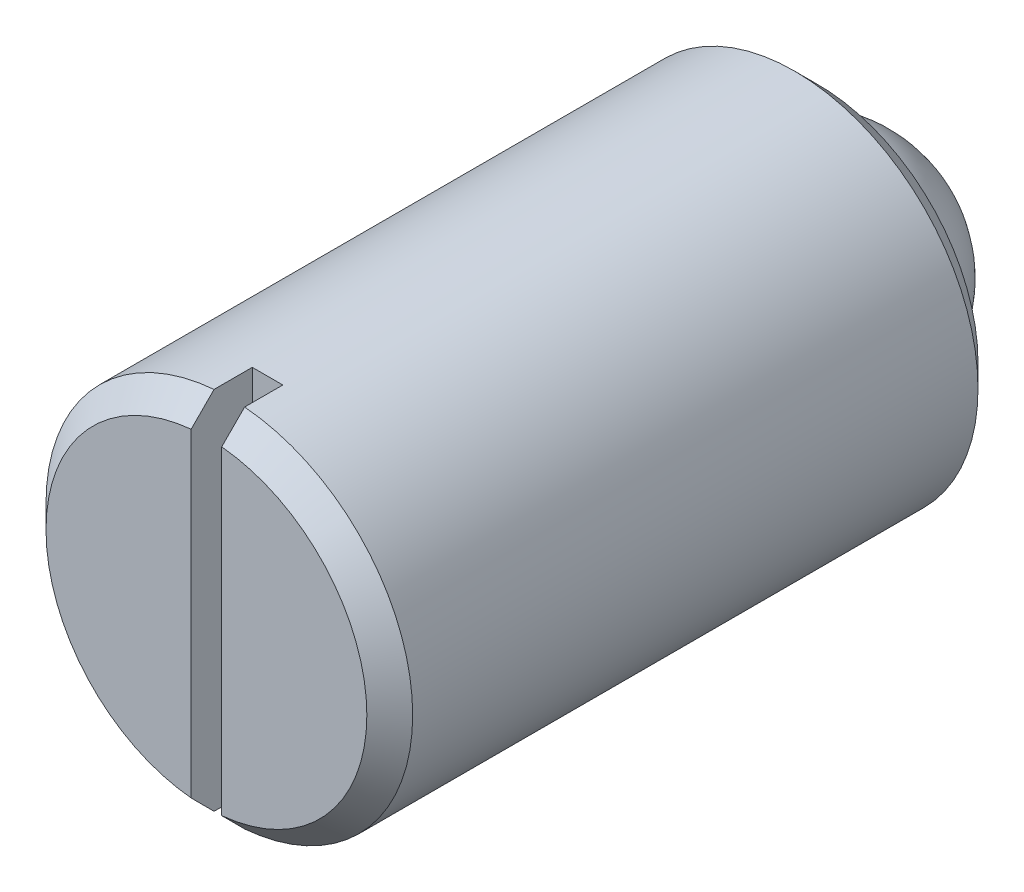
ISO-10303-21;
HEADER;
FILE_DESCRIPTION(('STEP AP214'),'2;1');
FILE_NAME('part.step','',(''),(''),'','','');
FILE_SCHEMA(('AUTOMOTIVE_DESIGN { 1 0 10303 214 1 1 1 1 }'));
ENDSEC;
DATA;
#1=APPLICATION_CONTEXT('core data for automotive mechanical design processes');
#2=APPLICATION_PROTOCOL_DEFINITION('international standard','automotive_design',2000,#1);
#3=PRODUCT_CONTEXT('',#1,'mechanical');
#4=PRODUCT('Part','Part','',(#3));
#5=PRODUCT_RELATED_PRODUCT_CATEGORY('part','',(#4));
#6=PRODUCT_DEFINITION_FORMATION('','',#4);
#7=PRODUCT_DEFINITION_CONTEXT('part definition',#1,'design');
#8=PRODUCT_DEFINITION('design','',#6,#7);
#9=PRODUCT_DEFINITION_SHAPE('','',#8);
#10=(LENGTH_UNIT() NAMED_UNIT(*) SI_UNIT(.MILLI.,.METRE.));
#11=(NAMED_UNIT(*) PLANE_ANGLE_UNIT() SI_UNIT($,.RADIAN.));
#12=(NAMED_UNIT(*) SI_UNIT($,.STERADIAN.) SOLID_ANGLE_UNIT());
#13=UNCERTAINTY_MEASURE_WITH_UNIT(LENGTH_MEASURE(1.E-05),#10,'distance_accuracy_value','');
#14=(GEOMETRIC_REPRESENTATION_CONTEXT(3) GLOBAL_UNCERTAINTY_ASSIGNED_CONTEXT((#13)) GLOBAL_UNIT_ASSIGNED_CONTEXT((#10,
#11,#12)) REPRESENTATION_CONTEXT('',''));
#15=CARTESIAN_POINT('',(0.,0.,0.));
#16=DIRECTION('',(0.,0.,1.));
#17=DIRECTION('',(1.,0.,0.));
#18=AXIS2_PLACEMENT_3D('',#15,#16,#17);
#19=CARTESIAN_POINT('',(0.,0.,0.));
#20=DIRECTION('',(0.,0.,1.));
#21=DIRECTION('',(1.,0.,0.));
#22=AXIS2_PLACEMENT_3D('',#19,#20,#21);
#23=PLANE('',#22);
#24=CARTESIAN_POINT('',(0.,0.,0.));
#25=DIRECTION('',(0.,0.,1.));
#26=DIRECTION('',(1.,0.,0.));
#27=AXIS2_PLACEMENT_3D('',#24,#25,#26);
#28=CIRCLE('',#27,5.25);
#29=CARTESIAN_POINT('',(5.25,0.,0.));
#30=VERTEX_POINT('',#29);
#31=EDGE_CURVE('E111',#30,#30,#28,.F.);
#32=ORIENTED_EDGE('',*,*,#31,.T.);
#33=EDGE_LOOP('',(#32));
#34=FACE_BOUND('',#33,.T.);
#35=CARTESIAN_POINT('',(0.,0.,0.));
#36=DIRECTION('',(0.,0.,1.));
#37=DIRECTION('',(1.,0.,0.));
#38=AXIS2_PLACEMENT_3D('',#35,#36,#37);
#39=CIRCLE('',#38,3.96862696659689);
#40=CARTESIAN_POINT('',(3.96862696659689,0.,0.));
#41=VERTEX_POINT('',#40);
#42=EDGE_CURVE('E11',#41,#41,#39,.F.);
#43=ORIENTED_EDGE('',*,*,#42,.F.);
#44=EDGE_LOOP('',(#43));
#45=FACE_BOUND('',#44,.T.);
#46=ADVANCED_FACE('F33',(#34,#45),#23,.F.);
#47=CARTESIAN_POINT('',(0.,0.,20.));
#48=DIRECTION('',(0.,0.,1.));
#49=DIRECTION('',(1.,0.,0.));
#50=AXIS2_PLACEMENT_3D('',#47,#48,#49);
#51=PLANE('',#50);
#52=DIRECTION('',(0.,-1.,0.));
#53=VECTOR('',#52,1.);
#54=CARTESIAN_POINT('',(-0.5,-5.9791303715507,20.));
#55=LINE('',#54,#53);
#56=CARTESIAN_POINT('',(-0.5,5.22613624009171,20.));
#57=VERTEX_POINT('',#56);
#58=CARTESIAN_POINT('',(-0.5,-5.22613624009171,20.));
#59=VERTEX_POINT('',#58);
#60=EDGE_CURVE('E85',#57,#59,#55,.T.);
#61=ORIENTED_EDGE('',*,*,#60,.F.);
#62=CARTESIAN_POINT('',(0.,0.,20.));
#63=DIRECTION('',(0.,0.,1.));
#64=DIRECTION('',(1.,0.,0.));
#65=AXIS2_PLACEMENT_3D('',#62,#63,#64);
#66=CIRCLE('',#65,5.25);
#67=EDGE_CURVE('E97',#57,#59,#66,.T.);
#68=ORIENTED_EDGE('',*,*,#67,.T.);
#69=EDGE_LOOP('',(#61,#68));
#70=FACE_BOUND('',#69,.T.);
#71=ADVANCED_FACE('F96',(#70),#51,.T.);
#72=CARTESIAN_POINT('',(0.,0.,20.));
#73=DIRECTION('',(0.,0.,-1.));
#74=DIRECTION('',(-1.,0.,0.));
#75=AXIS2_PLACEMENT_3D('',#72,#73,#74);
#76=CONICAL_SURFACE('',#75,5.25,0.785398163397442);
#77=CARTESIAN_POINT('',(-0.5,9.92785552367159,15.3095616143503));
#78=CARTESIAN_POINT('',(-0.5,9.55208986103591,15.684845998594));
#79=CARTESIAN_POINT('',(-0.5,9.17630246654769,16.0601086400427));
#80=CARTESIAN_POINT('',(-0.5,8.42465346395782,16.8105507691537));
#81=CARTESIAN_POINT('',(-0.5,8.04879185677857,17.1857302577398));
#82=CARTESIAN_POINT('',(-0.5,7.29696704537191,17.9359630642628));
#83=CARTESIAN_POINT('',(-0.5,6.92100384483147,18.3110163858942));
#84=CARTESIAN_POINT('',(-0.5,6.16889213458774,19.0609458038307));
#85=CARTESIAN_POINT('',(-0.5,5.79274362282101,19.4358218980669));
#86=CARTESIAN_POINT('',(-0.5,5.22826724423608,19.9979065070319));
#87=CARTESIAN_POINT('',(-0.5,5.04005989371646,20.1852360397427));
#88=CARTESIAN_POINT('',(-0.5,4.66353260389824,20.559780241167));
#89=CARTESIAN_POINT('',(-0.5,4.47521266510877,20.7469949103924));
#90=CARTESIAN_POINT('',(-0.5,4.09841687086862,21.1212541999924));
#91=CARTESIAN_POINT('',(-0.5,3.90994102107969,21.3082988260653));
#92=CARTESIAN_POINT('',(-0.5,3.53273897497511,21.6821415648597));
#93=CARTESIAN_POINT('',(-0.5,3.34401277468829,21.8689396735749));
#94=CARTESIAN_POINT('',(-0.5,2.96614271210536,22.2421588353597));
#95=CARTESIAN_POINT('',(-0.5,2.77699880247174,22.4285798405656));
#96=CARTESIAN_POINT('',(-0.5,2.49275132554391,22.707659712793));
#97=CARTESIAN_POINT('',(-0.5,2.39791616363466,22.8005918652702));
#98=CARTESIAN_POINT('',(-0.5,2.20798895317973,22.9861967088872));
#99=CARTESIAN_POINT('',(-0.5,2.11289690036256,23.0788693956599));
#100=CARTESIAN_POINT('',(-0.5,1.92232227766392,23.2638485818307));
#101=CARTESIAN_POINT('',(-0.5,1.82683963753384,23.3561550088927));
#102=CARTESIAN_POINT('',(-0.5,1.63530782922047,23.5401711609692));
#103=CARTESIAN_POINT('',(-0.5,1.53925868757899,23.6318809135224));
#104=CARTESIAN_POINT('',(-0.5,1.39445591778969,23.7686960304433));
#105=CARTESIAN_POINT('',(-0.5,1.34606145186328,23.814181115599));
#106=CARTESIAN_POINT('',(-0.5,1.24894665245089,23.9047998156198));
#107=CARTESIAN_POINT('',(-0.5,1.20022632714219,23.9499334392437));
#108=CARTESIAN_POINT('',(-0.5,1.10233613956681,24.0397291511785));
#109=CARTESIAN_POINT('',(-0.5,1.05316620438443,24.0843911603806));
#110=CARTESIAN_POINT('',(-0.5,0.954163828114459,24.1729822862607));
#111=CARTESIAN_POINT('',(-0.5,0.904331329393397,24.2169113384226));
#112=CARTESIAN_POINT('',(-0.5,0.854061372818657,24.2603430753333));
#113=B_SPLINE_CURVE_WITH_KNOTS('',3,(#77,#78,#79,#80,#81,#82,#83,#84,#85,#86,#87,#88,#89,#90,
#91,#92,#93,#94,#95,#96,#97,#98,#99,#100,#101,#102,#103,#104,#105,#106,#107,#108,#109,#110,#111,
#112),.UNSPECIFIED.,.F.,.F.,(4,2,2,2,2,2,2,2,2,2,2,2,2,2,2,2,2,4),(0.,1.59321808890009,
3.18641748626993,4.77956525558484,6.37273118470356,7.16936735624743,7.96599995213189,
8.76260478854389,9.55922241590227,10.355935499873,10.75427026916,11.1526117031128,
11.5510282412514,11.9494262586934,12.1486691296625,12.3479070193428,12.5471778147686,
12.7464660587827),.UNSPECIFIED.);
#114=CARTESIAN_POINT('',(-0.5,5.9791303715507,19.25));
#115=VERTEX_POINT('',#114);
#116=EDGE_CURVE('E82',#115,#57,#113,.T.);
#117=ORIENTED_EDGE('',*,*,#116,.F.);
#118=CARTESIAN_POINT('',(0.,0.,19.25));
#119=DIRECTION('',(0.,0.,1.));
#120=DIRECTION('',(1.,0.,0.));
#121=AXIS2_PLACEMENT_3D('',#118,#119,#120);
#122=CIRCLE('',#121,6.);
#123=CARTESIAN_POINT('',(-0.5,-5.9791303715507,19.25));
#124=VERTEX_POINT('',#123);
#125=EDGE_CURVE('E120',#124,#115,#122,.F.);
#126=ORIENTED_EDGE('',*,*,#125,.F.);
#127=CARTESIAN_POINT('',(-0.5,-0.854061372818657,24.2603430753333));
#128=CARTESIAN_POINT('',(-0.5,-0.890663688130079,24.2287410615308));
#129=CARTESIAN_POINT('',(-0.5,-0.927023175140503,24.1968613113027));
#130=CARTESIAN_POINT('',(-0.5,-0.999355657248269,24.1326697518856));
#131=CARTESIAN_POINT('',(-0.5,-1.03532867306181,24.1003579660658));
#132=CARTESIAN_POINT('',(-0.5,-1.14281242968219,24.0029637212403));
#133=CARTESIAN_POINT('',(-0.5,-1.21389822374194,23.937413325114));
#134=CARTESIAN_POINT('',(-0.5,-1.35535946982899,23.8055801291376));
#135=CARTESIAN_POINT('',(-0.5,-1.42573505068665,23.7392974668597));
#136=CARTESIAN_POINT('',(-0.5,-1.56602555539737,23.6062403724618));
#137=CARTESIAN_POINT('',(-0.5,-1.63594045739789,23.5394659173271));
#138=CARTESIAN_POINT('',(-0.5,-1.84513158259419,23.3387312538789));
#139=CARTESIAN_POINT('',(-0.5,-1.98393738517831,23.2042814333445));
#140=CARTESIAN_POINT('',(-0.5,-2.2608834189938,22.9346976243412));
#141=CARTESIAN_POINT('',(-0.5,-2.39902364393293,22.799563629429));
#142=CARTESIAN_POINT('',(-0.5,-2.81285574928011,22.3935636082175));
#143=CARTESIAN_POINT('',(-0.5,-3.08795984462832,22.1220987847406));
#144=CARTESIAN_POINT('',(-0.5,-3.63755330185618,21.5784507138305));
#145=CARTESIAN_POINT('',(-0.5,-3.91204254425767,21.3062673459524));
#146=CARTESIAN_POINT('',(-0.5,-4.460651978155,20.7615316622949));
#147=CARTESIAN_POINT('',(-0.5,-4.73477217159451,20.4889793484739));
#148=CARTESIAN_POINT('',(-0.5,-5.07674086011498,20.14870069462));
#149=CARTESIAN_POINT('',(-0.5,-5.14468943255713,20.0810748191367));
#150=CARTESIAN_POINT('',(-0.5,-5.28057188169016,19.9458132522244));
#151=CARTESIAN_POINT('',(-0.5,-5.34850575882625,19.8781775612426));
#152=CARTESIAN_POINT('',(-0.5,-5.79270269418511,19.4358620966435));
#153=CARTESIAN_POINT('',(-0.5,-6.16881079662503,19.0610267145125));
#154=CARTESIAN_POINT('',(-0.5,-6.92084581271849,18.3111741496641));
#155=CARTESIAN_POINT('',(-0.5,-7.29677272633867,17.9361569669132));
#156=CARTESIAN_POINT('',(-0.5,-8.04860198707189,17.1859197307551));
#157=CARTESIAN_POINT('',(-0.5,-8.42450430722193,16.8106996503289));
#158=CARTESIAN_POINT('',(-0.5,-9.17623018174267,16.0601808438369));
#159=CARTESIAN_POINT('',(-0.5,-9.55205373613945,15.6848821177973));
#160=CARTESIAN_POINT('',(-0.5,-9.92785552367159,15.3095616143503));
#161=B_SPLINE_CURVE_WITH_KNOTS('',3,(#127,#128,#129,#130,#131,#132,#133,#134,#135,#136,#137,
#138,#139,#140,#141,#142,#143,#144,#145,#146,#147,#148,#149,#150,#151,#152,#153,#154,#155,#156,
#157,#158,#159,#160),.UNSPECIFIED.,.F.,.F.,(4,2,2,2,2,2,2,2,2,2,2,2,2,2,2,2,4),(0.,
0.145066793652974,0.290125772027515,0.580202504059539,0.870225635506728,1.16026242672066,
1.73999333365692,2.31972971054564,3.47919918631749,4.63887722490446,5.79854913168538,
6.0861467854372,6.3737339611719,7.96672780035323,9.55972193274675,11.153093803501,
12.7464651458822),.UNSPECIFIED.);
#162=EDGE_CURVE('E101',#59,#124,#161,.T.);
#163=ORIENTED_EDGE('',*,*,#162,.F.);
#164=ORIENTED_EDGE('',*,*,#67,.F.);
#165=EDGE_LOOP('',(#117,#126,#163,#164));
#166=FACE_BOUND('',#165,.T.);
#167=ADVANCED_FACE('F100',(#166),#76,.T.);
#168=CARTESIAN_POINT('',(0.5,0.854061372818657,24.2603430753333));
#169=CARTESIAN_POINT('',(0.5,0.890663688130079,24.2287410615308));
#170=CARTESIAN_POINT('',(0.5,0.927023175140503,24.1968613113027));
#171=CARTESIAN_POINT('',(0.5,0.999355657248269,24.1326697518856));
#172=CARTESIAN_POINT('',(0.5,1.03532867306181,24.1003579660658));
#173=CARTESIAN_POINT('',(0.5,1.14281242968219,24.0029637212403));
#174=CARTESIAN_POINT('',(0.5,1.21389822374194,23.937413325114));
#175=CARTESIAN_POINT('',(0.5,1.35535946982899,23.8055801291376));
#176=CARTESIAN_POINT('',(0.5,1.42573505068665,23.7392974668597));
#177=CARTESIAN_POINT('',(0.5,1.56602555539737,23.6062403724618));
#178=CARTESIAN_POINT('',(0.5,1.63594045739789,23.5394659173271));
#179=CARTESIAN_POINT('',(0.5,1.84513158259419,23.3387312538789));
#180=CARTESIAN_POINT('',(0.5,1.98393738517831,23.2042814333445));
#181=CARTESIAN_POINT('',(0.5,2.2608834189938,22.9346976243412));
#182=CARTESIAN_POINT('',(0.5,2.39902364393293,22.799563629429));
#183=CARTESIAN_POINT('',(0.5,2.81285574928011,22.3935636082175));
#184=CARTESIAN_POINT('',(0.5,3.08795984462832,22.1220987847406));
#185=CARTESIAN_POINT('',(0.5,3.63755330185618,21.5784507138305));
#186=CARTESIAN_POINT('',(0.5,3.91204254425767,21.3062673459524));
#187=CARTESIAN_POINT('',(0.5,4.460651978155,20.7615316622949));
#188=CARTESIAN_POINT('',(0.5,4.73477217159451,20.4889793484739));
#189=CARTESIAN_POINT('',(0.5,5.07674086011498,20.14870069462));
#190=CARTESIAN_POINT('',(0.5,5.14468943255713,20.0810748191367));
#191=CARTESIAN_POINT('',(0.5,5.28057188169016,19.9458132522244));
#192=CARTESIAN_POINT('',(0.5,5.34850575882625,19.8781775612426));
#193=CARTESIAN_POINT('',(0.5,5.79270269418511,19.4358620966435));
#194=CARTESIAN_POINT('',(0.5,6.16881079662503,19.0610267145125));
#195=CARTESIAN_POINT('',(0.5,6.92084581271849,18.3111741496641));
#196=CARTESIAN_POINT('',(0.5,7.29677272633867,17.9361569669132));
#197=CARTESIAN_POINT('',(0.5,8.04860198707189,17.1859197307551));
#198=CARTESIAN_POINT('',(0.5,8.42450430722193,16.8106996503289));
#199=CARTESIAN_POINT('',(0.5,9.17623018174267,16.0601808438369));
#200=CARTESIAN_POINT('',(0.5,9.55205373613945,15.6848821177973));
#201=CARTESIAN_POINT('',(0.5,9.92785552367159,15.3095616143503));
#202=B_SPLINE_CURVE_WITH_KNOTS('',3,(#168,#169,#170,#171,#172,#173,#174,#175,#176,#177,#178,
#179,#180,#181,#182,#183,#184,#185,#186,#187,#188,#189,#190,#191,#192,#193,#194,#195,#196,#197,
#198,#199,#200,#201),.UNSPECIFIED.,.F.,.F.,(4,2,2,2,2,2,2,2,2,2,2,2,2,2,2,2,4),(0.,
0.145066793652974,0.290125772027515,0.580202504059539,0.870225635506728,1.16026242672066,
1.73999333365692,2.31972971054564,3.47919918631749,4.63887722490446,5.79854913168538,
6.0861467854372,6.3737339611719,7.96672780035323,9.55972193274675,11.153093803501,
12.7464651458822),.UNSPECIFIED.);
#203=CARTESIAN_POINT('',(0.5,5.22613624009171,20.));
#204=VERTEX_POINT('',#203);
#205=CARTESIAN_POINT('',(0.5,5.9791303715507,19.25));
#206=VERTEX_POINT('',#205);
#207=EDGE_CURVE('E149',#204,#206,#202,.T.);
#208=ORIENTED_EDGE('',*,*,#207,.F.);
#209=CARTESIAN_POINT('',(0.5,-5.22613624009171,20.));
#210=VERTEX_POINT('',#209);
#211=EDGE_CURVE('E104',#210,#204,#66,.T.);
#212=ORIENTED_EDGE('',*,*,#211,.F.);
#213=CARTESIAN_POINT('',(0.5,-9.92785552367159,15.3095616143503));
#214=CARTESIAN_POINT('',(0.5,-9.55208986103591,15.684845998594));
#215=CARTESIAN_POINT('',(0.5,-9.17630246654769,16.0601086400427));
#216=CARTESIAN_POINT('',(0.5,-8.42465346395782,16.8105507691537));
#217=CARTESIAN_POINT('',(0.5,-8.04879185677857,17.1857302577398));
#218=CARTESIAN_POINT('',(0.5,-7.29696704537191,17.9359630642628));
#219=CARTESIAN_POINT('',(0.5,-6.92100384483147,18.3110163858942));
#220=CARTESIAN_POINT('',(0.5,-6.16889213458774,19.0609458038307));
#221=CARTESIAN_POINT('',(0.5,-5.79274362282101,19.4358218980669));
#222=CARTESIAN_POINT('',(0.5,-5.22826724423608,19.9979065070319));
#223=CARTESIAN_POINT('',(0.5,-5.04005989371646,20.1852360397427));
#224=CARTESIAN_POINT('',(0.5,-4.66353260389824,20.559780241167));
#225=CARTESIAN_POINT('',(0.5,-4.47521266510877,20.7469949103924));
#226=CARTESIAN_POINT('',(0.5,-4.09841687086862,21.1212541999924));
#227=CARTESIAN_POINT('',(0.5,-3.90994102107969,21.3082988260653));
#228=CARTESIAN_POINT('',(0.5,-3.53273897497511,21.6821415648597));
#229=CARTESIAN_POINT('',(0.5,-3.34401277468829,21.8689396735749));
#230=CARTESIAN_POINT('',(0.5,-2.96614271210536,22.2421588353597));
#231=CARTESIAN_POINT('',(0.5,-2.77699880247174,22.4285798405656));
#232=CARTESIAN_POINT('',(0.5,-2.49275132554391,22.707659712793));
#233=CARTESIAN_POINT('',(0.5,-2.39791616363466,22.8005918652702));
#234=CARTESIAN_POINT('',(0.5,-2.20798895317973,22.9861967088872));
#235=CARTESIAN_POINT('',(0.5,-2.11289690036256,23.0788693956599));
#236=CARTESIAN_POINT('',(0.5,-1.92232227766392,23.2638485818307));
#237=CARTESIAN_POINT('',(0.5,-1.82683963753384,23.3561550088927));
#238=CARTESIAN_POINT('',(0.5,-1.63530782922047,23.5401711609692));
#239=CARTESIAN_POINT('',(0.5,-1.53925868757899,23.6318809135224));
#240=CARTESIAN_POINT('',(0.5,-1.39445591778969,23.7686960304433));
#241=CARTESIAN_POINT('',(0.5,-1.34606145186328,23.814181115599));
#242=CARTESIAN_POINT('',(0.5,-1.24894665245089,23.9047998156198));
#243=CARTESIAN_POINT('',(0.5,-1.20022632714219,23.9499334392437));
#244=CARTESIAN_POINT('',(0.5,-1.10233613956681,24.0397291511785));
#245=CARTESIAN_POINT('',(0.5,-1.05316620438443,24.0843911603806));
#246=CARTESIAN_POINT('',(0.5,-0.954163828114459,24.1729822862607));
#247=CARTESIAN_POINT('',(0.5,-0.904331329393397,24.2169113384226));
#248=CARTESIAN_POINT('',(0.5,-0.854061372818657,24.2603430753333));
#249=B_SPLINE_CURVE_WITH_KNOTS('',3,(#213,#214,#215,#216,#217,#218,#219,#220,#221,#222,#223,
#224,#225,#226,#227,#228,#229,#230,#231,#232,#233,#234,#235,#236,#237,#238,#239,#240,#241,#242,
#243,#244,#245,#246,#247,#248),.UNSPECIFIED.,.F.,.F.,(4,2,2,2,2,2,2,2,2,2,2,2,2,2,2,2,2,4),(0.,
1.59321808890009,3.18641748626993,4.77956525558484,6.37273118470356,7.16936735624743,
7.96599995213189,8.76260478854389,9.55922241590227,10.355935499873,10.75427026916,
11.1526117031128,11.5510282412514,11.9494262586934,12.1486691296625,12.3479070193428,
12.5471778147686,12.7464660587827),.UNSPECIFIED.);
#250=CARTESIAN_POINT('',(0.5,-5.9791303715507,19.25));
#251=VERTEX_POINT('',#250);
#252=EDGE_CURVE('E117',#251,#210,#249,.T.);
#253=ORIENTED_EDGE('',*,*,#252,.F.);
#254=EDGE_CURVE('E106',#206,#251,#122,.F.);
#255=ORIENTED_EDGE('',*,*,#254,.F.);
#256=EDGE_LOOP('',(#208,#212,#253,#255));
#257=FACE_BOUND('',#256,.T.);
#258=ADVANCED_FACE('F136',(#257),#76,.T.);
#259=CARTESIAN_POINT('',(0.,0.,20.));
#260=DIRECTION('',(0.,0.,-1.));
#261=DIRECTION('',(-1.,0.,0.));
#262=AXIS2_PLACEMENT_3D('',#259,#260,#261);
#263=CYLINDRICAL_SURFACE('',#262,6.);
#264=CARTESIAN_POINT('',(0.5,5.9791303715507,18.));
#265=DIRECTION('',(-1.,0.,0.));
#266=VECTOR('',#265,1.);
#267=LINE('',#264,#266);
#268=CARTESIAN_POINT('',(0.5,5.9791303715507,18.));
#269=VERTEX_POINT('',#268);
#270=CARTESIAN_POINT('',(-0.5,5.9791303715507,18.));
#271=VERTEX_POINT('',#270);
#272=EDGE_CURVE('E43',#269,#271,#267,.T.);
#273=ORIENTED_EDGE('',*,*,#272,.F.);
#274=DIRECTION('',(0.,0.,-1.));
#275=VECTOR('',#274,1.);
#276=CARTESIAN_POINT('',(0.5,5.9791303715507,20.));
#277=LINE('',#276,#275);
#278=EDGE_CURVE('E102',#269,#206,#277,.F.);
#279=ORIENTED_EDGE('',*,*,#278,.T.);
#280=ORIENTED_EDGE('',*,*,#254,.T.);
#281=DIRECTION('',(0.,0.,1.));
#282=VECTOR('',#281,1.);
#283=CARTESIAN_POINT('',(0.5,-5.9791303715507,18.));
#284=LINE('',#283,#282);
#285=CARTESIAN_POINT('',(0.5,-5.9791303715507,18.));
#286=VERTEX_POINT('',#285);
#287=EDGE_CURVE('E153',#286,#251,#284,.T.);
#288=ORIENTED_EDGE('',*,*,#287,.F.);
#289=CARTESIAN_POINT('',(-0.5,-5.9791303715507,18.));
#290=DIRECTION('',(1.,0.,0.));
#291=VECTOR('',#290,1.);
#292=LINE('',#289,#291);
#293=CARTESIAN_POINT('',(-0.5,-5.9791303715507,18.));
#294=VERTEX_POINT('',#293);
#295=EDGE_CURVE('E163',#294,#286,#292,.T.);
#296=ORIENTED_EDGE('',*,*,#295,.F.);
#297=DIRECTION('',(0.,0.,1.));
#298=VECTOR('',#297,1.);
#299=CARTESIAN_POINT('',(-0.5,-5.9791303715507,18.));
#300=LINE('',#299,#298);
#301=EDGE_CURVE('E123',#294,#124,#300,.T.);
#302=ORIENTED_EDGE('',*,*,#301,.T.);
#303=ORIENTED_EDGE('',*,*,#125,.T.);
#304=DIRECTION('',(0.,0.,-1.));
#305=VECTOR('',#304,1.);
#306=CARTESIAN_POINT('',(-0.500000000000018,5.9791303715507,20.));
#307=LINE('',#306,#305);
#308=EDGE_CURVE('E88',#271,#115,#307,.F.);
#309=ORIENTED_EDGE('',*,*,#308,.F.);
#310=EDGE_LOOP('',(#273,#279,#280,#288,#296,#302,#303,#309));
#311=FACE_BOUND('',#310,.T.);
#312=CARTESIAN_POINT('',(0.,0.,0.750000000000015));
#313=DIRECTION('',(0.,0.,1.));
#314=DIRECTION('',(1.,0.,0.));
#315=AXIS2_PLACEMENT_3D('',#312,#313,#314);
#316=CIRCLE('',#315,6.);
#317=CARTESIAN_POINT('',(6.,0.,0.750000000000015));
#318=VERTEX_POINT('',#317);
#319=EDGE_CURVE('E112',#318,#318,#316,.T.);
#320=ORIENTED_EDGE('',*,*,#319,.T.);
#321=EDGE_LOOP('',(#320));
#322=FACE_BOUND('',#321,.T.);
#323=ADVANCED_FACE('F35',(#311,#322),#263,.T.);
#324=DIRECTION('',(0.,1.,0.));
#325=VECTOR('',#324,1.);
#326=CARTESIAN_POINT('',(0.5,-5.9791303715507,20.));
#327=LINE('',#326,#325);
#328=EDGE_CURVE('E130',#210,#204,#327,.T.);
#329=ORIENTED_EDGE('',*,*,#328,.F.);
#330=ORIENTED_EDGE('',*,*,#211,.T.);
#331=EDGE_LOOP('',(#329,#330));
#332=FACE_BOUND('',#331,.T.);
#333=ADVANCED_FACE('F215',(#332),#51,.T.);
#334=CARTESIAN_POINT('',(0.,0.,0.750000000000015));
#335=DIRECTION('',(0.,0.,1.));
#336=DIRECTION('',(1.,0.,0.));
#337=AXIS2_PLACEMENT_3D('',#334,#335,#336);
#338=CONICAL_SURFACE('',#337,6.,0.785398163397442);
#339=ORIENTED_EDGE('',*,*,#31,.F.);
#340=EDGE_LOOP('',(#339));
#341=FACE_BOUND('',#340,.T.);
#342=ORIENTED_EDGE('',*,*,#319,.F.);
#343=EDGE_LOOP('',(#342));
#344=FACE_BOUND('',#343,.T.);
#345=ADVANCED_FACE('F142',(#341,#344),#338,.T.);
#346=CARTESIAN_POINT('',(0.5,-5.9791303715507,18.));
#347=DIRECTION('',(1.,0.,0.));
#348=DIRECTION('',(0.,0.,-1.));
#349=AXIS2_PLACEMENT_3D('',#346,#347,#348);
#350=PLANE('',#349);
#351=ORIENTED_EDGE('',*,*,#252,.T.);
#352=ORIENTED_EDGE('',*,*,#328,.T.);
#353=ORIENTED_EDGE('',*,*,#207,.T.);
#354=ORIENTED_EDGE('',*,*,#278,.F.);
#355=DIRECTION('',(0.,1.,0.));
#356=VECTOR('',#355,1.);
#357=CARTESIAN_POINT('',(0.5,-5.9791303715507,18.));
#358=LINE('',#357,#356);
#359=EDGE_CURVE('E51',#286,#269,#358,.T.);
#360=ORIENTED_EDGE('',*,*,#359,.F.);
#361=ORIENTED_EDGE('',*,*,#287,.T.);
#362=EDGE_LOOP('',(#351,#352,#353,#354,#360,#361));
#363=FACE_BOUND('',#362,.T.);
#364=ADVANCED_FACE('F139',(#363),#350,.F.);
#365=CARTESIAN_POINT('',(-0.5,-5.9791303715507,18.));
#366=DIRECTION('',(-1.,0.,0.));
#367=DIRECTION('',(0.,0.,1.));
#368=AXIS2_PLACEMENT_3D('',#365,#366,#367);
#369=PLANE('',#368);
#370=ORIENTED_EDGE('',*,*,#162,.T.);
#371=ORIENTED_EDGE('',*,*,#301,.F.);
#372=DIRECTION('',(0.,-1.,0.));
#373=VECTOR('',#372,1.);
#374=CARTESIAN_POINT('',(-0.5,-5.9791303715507,18.));
#375=LINE('',#374,#373);
#376=EDGE_CURVE('E98',#271,#294,#375,.T.);
#377=ORIENTED_EDGE('',*,*,#376,.F.);
#378=ORIENTED_EDGE('',*,*,#308,.T.);
#379=ORIENTED_EDGE('',*,*,#116,.T.);
#380=ORIENTED_EDGE('',*,*,#60,.T.);
#381=EDGE_LOOP('',(#370,#371,#377,#378,#379,#380));
#382=FACE_BOUND('',#381,.T.);
#383=ADVANCED_FACE('F84',(#382),#369,.F.);
#384=CARTESIAN_POINT('',(-0.5,-5.9791303715507,18.));
#385=DIRECTION('',(0.,0.,-1.));
#386=DIRECTION('',(-1.,0.,0.));
#387=AXIS2_PLACEMENT_3D('',#384,#385,#386);
#388=PLANE('',#387);
#389=ORIENTED_EDGE('',*,*,#376,.T.);
#390=ORIENTED_EDGE('',*,*,#295,.T.);
#391=ORIENTED_EDGE('',*,*,#359,.T.);
#392=ORIENTED_EDGE('',*,*,#272,.T.);
#393=EDGE_LOOP('',(#389,#390,#391,#392));
#394=FACE_BOUND('',#393,.T.);
#395=ADVANCED_FACE('F146',(#394),#388,.F.);
#396=CARTESIAN_POINT('',(0.,0.,0.5));
#397=DIRECTION('',(0.,0.,-1.));
#398=DIRECTION('',(1.,0.,0.));
#399=AXIS2_PLACEMENT_3D('',#396,#397,#398);
#400=SPHERICAL_SURFACE('',#399,4.);
#401=ORIENTED_EDGE('',*,*,#42,.T.);
#402=EDGE_LOOP('',(#401));
#403=FACE_BOUND('',#402,.T.);
#404=ADVANCED_FACE('F252',(#403),#400,.T.);
#405=CLOSED_SHELL('',(#46,#71,#167,#258,#323,#333,#345,#364,#383,#395,#404));
#406=MANIFOLD_SOLID_BREP('B2',#405);
#407=ADVANCED_BREP_SHAPE_REPRESENTATION('',(#18,#406),#14);
#408=SHAPE_DEFINITION_REPRESENTATION(#9,#407);
ENDSEC;
END-ISO-10303-21;
